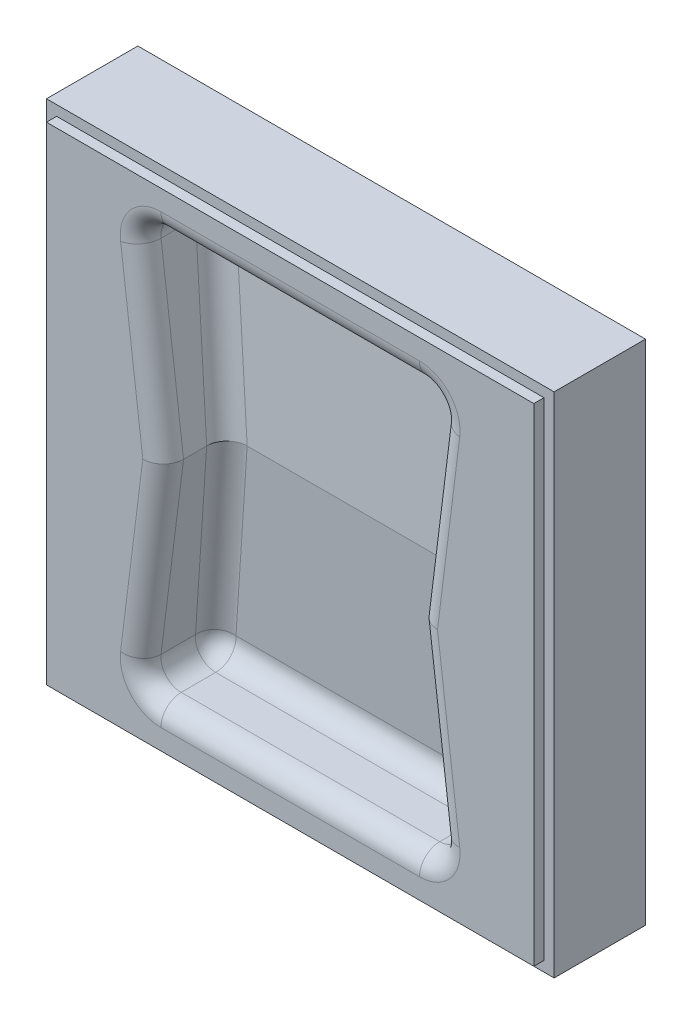
ISO-10303-21;
HEADER;
FILE_DESCRIPTION(('STEP AP214'),'2;1');
FILE_NAME('part.step','',(''),(''),'','','');
FILE_SCHEMA(('AUTOMOTIVE_DESIGN { 1 0 10303 214 1 1 1 1 }'));
ENDSEC;
DATA;
#1=APPLICATION_CONTEXT('core data for automotive mechanical design processes');
#2=APPLICATION_PROTOCOL_DEFINITION('international standard','automotive_design',2000,#1);
#3=PRODUCT_CONTEXT('',#1,'mechanical');
#4=PRODUCT('Part','Part','',(#3));
#5=PRODUCT_RELATED_PRODUCT_CATEGORY('part','',(#4));
#6=PRODUCT_DEFINITION_FORMATION('','',#4);
#7=PRODUCT_DEFINITION_CONTEXT('part definition',#1,'design');
#8=PRODUCT_DEFINITION('design','',#6,#7);
#9=PRODUCT_DEFINITION_SHAPE('','',#8);
#10=(LENGTH_UNIT() NAMED_UNIT(*) SI_UNIT(.MILLI.,.METRE.));
#11=(NAMED_UNIT(*) PLANE_ANGLE_UNIT() SI_UNIT($,.RADIAN.));
#12=(NAMED_UNIT(*) SI_UNIT($,.STERADIAN.) SOLID_ANGLE_UNIT());
#13=UNCERTAINTY_MEASURE_WITH_UNIT(LENGTH_MEASURE(1.E-05),#10,'distance_accuracy_value','');
#14=(GEOMETRIC_REPRESENTATION_CONTEXT(3) GLOBAL_UNCERTAINTY_ASSIGNED_CONTEXT((#13)) GLOBAL_UNIT_ASSIGNED_CONTEXT((#10,
#11,#12)) REPRESENTATION_CONTEXT('',''));
#15=CARTESIAN_POINT('',(0.,0.,0.));
#16=DIRECTION('',(0.,0.,1.));
#17=DIRECTION('',(1.,0.,0.));
#18=AXIS2_PLACEMENT_3D('',#15,#16,#17);
#19=CARTESIAN_POINT('',(15.3846153846154,1.92307692307692,7.5));
#20=DIRECTION('',(0.992277876713668,0.124034734589208,0.));
#21=DIRECTION('',(-0.124034734589208,0.992277876713668,0.));
#22=AXIS2_PLACEMENT_3D('',#19,#20,#21);
#23=PLANE('',#22);
#24=DIRECTION('',(0.,0.,1.));
#25=VECTOR('',#24,1.);
#26=CARTESIAN_POINT('',(10.2810086836473,42.7519305308216,15.));
#27=LINE('',#26,#25);
#28=CARTESIAN_POINT('',(10.2810086836473,42.7519305308216,9.60049247781464));
#29=VERTEX_POINT('',#28);
#30=CARTESIAN_POINT('',(10.2810086836473,42.7519305308216,13.));
#31=VERTEX_POINT('',#30);
#32=EDGE_CURVE('E320',#29,#31,#27,.T.);
#33=ORIENTED_EDGE('',*,*,#32,.T.);
#34=DIRECTION('',(-0.124034734589208,0.992277876713668,0.));
#35=VECTOR('',#34,1.);
#36=CARTESIAN_POINT('',(12.5,25.,13.));
#37=LINE('',#36,#35);
#38=CARTESIAN_POINT('',(12.5,25.,13.));
#39=VERTEX_POINT('',#38);
#40=EDGE_CURVE('E433',#31,#39,#37,.F.);
#41=ORIENTED_EDGE('',*,*,#40,.T.);
#42=DIRECTION('',(0.,0.,1.));
#43=VECTOR('',#42,1.);
#44=CARTESIAN_POINT('',(12.5,25.,7.5));
#45=LINE('',#44,#43);
#46=CARTESIAN_POINT('',(12.5,25.,10.72330400165));
#47=VERTEX_POINT('',#46);
#48=EDGE_CURVE('E515',#47,#39,#45,.T.);
#49=ORIENTED_EDGE('',*,*,#48,.F.);
#50=DIRECTION('',(-0.123791165723687,0.990329325789502,-0.0626384368425683));
#51=VECTOR('',#50,1.);
#52=CARTESIAN_POINT('',(15.3483036097725,2.21357112182013,12.1645480898382));
#53=LINE('',#52,#51);
#54=EDGE_CURVE('E276',#47,#29,#53,.T.);
#55=ORIENTED_EDGE('',*,*,#54,.T.);
#56=EDGE_LOOP('',(#33,#41,#49,#55));
#57=FACE_BOUND('',#56,.T.);
#58=ADVANCED_FACE('F72',(#57),#23,.T.);
#59=CARTESIAN_POINT('',(33.8461538461539,-4.23076923076926,7.5));
#60=DIRECTION('',(-0.992277876713668,0.124034734589209,0.));
#61=DIRECTION('',(-0.124034734589209,-0.992277876713668,0.));
#62=AXIS2_PLACEMENT_3D('',#59,#60,#61);
#63=PLANE('',#62);
#64=DIRECTION('',(0.,0.,-1.));
#65=VECTOR('',#64,1.);
#66=CARTESIAN_POINT('',(37.5,25.,7.5));
#67=LINE('',#66,#65);
#68=CARTESIAN_POINT('',(37.5,25.,13.));
#69=VERTEX_POINT('',#68);
#70=CARTESIAN_POINT('',(37.5,25.,10.72330400165));
#71=VERTEX_POINT('',#70);
#72=EDGE_CURVE('E508',#69,#71,#67,.T.);
#73=ORIENTED_EDGE('',*,*,#72,.F.);
#74=DIRECTION('',(-0.124034734589209,-0.992277876713668,0.));
#75=VECTOR('',#74,1.);
#76=CARTESIAN_POINT('',(39.7189913163527,42.7519305308216,13.));
#77=LINE('',#76,#75);
#78=CARTESIAN_POINT('',(39.7189913163527,42.7519305308216,13.));
#79=VERTEX_POINT('',#78);
#80=EDGE_CURVE('E440',#69,#79,#77,.F.);
#81=ORIENTED_EDGE('',*,*,#80,.T.);
#82=DIRECTION('',(0.,0.,1.));
#83=VECTOR('',#82,1.);
#84=CARTESIAN_POINT('',(39.7189913163527,42.7519305308216,9.45830184102766));
#85=LINE('',#84,#83);
#86=CARTESIAN_POINT('',(39.7189913163527,42.7519305308216,9.60049247781464));
#87=VERTEX_POINT('',#86);
#88=EDGE_CURVE('E365',#79,#87,#85,.F.);
#89=ORIENTED_EDGE('',*,*,#88,.T.);
#90=DIRECTION('',(-0.123791165723688,-0.990329325789502,0.0626384368425683));
#91=VECTOR('',#90,1.);
#92=CARTESIAN_POINT('',(33.885483754666,-3.91612996267166,12.5522523456308));
#93=LINE('',#92,#91);
#94=EDGE_CURVE('E316',#87,#71,#93,.T.);
#95=ORIENTED_EDGE('',*,*,#94,.T.);
#96=EDGE_LOOP('',(#73,#81,#89,#95));
#97=FACE_BOUND('',#96,.T.);
#98=ADVANCED_FACE('F510',(#97),#63,.T.);
#99=CARTESIAN_POINT('',(0.,0.,15.));
#100=DIRECTION('',(0.,0.,-1.));
#101=DIRECTION('',(-1.,0.,0.));
#102=AXIS2_PLACEMENT_3D('',#99,#100,#101);
#103=PLANE('',#102);
#104=CARTESIAN_POINT('',(12.2655644370747,43.,15.));
#105=DIRECTION('',(0.,0.,-1.));
#106=DIRECTION('',(-1.,0.,0.));
#107=AXIS2_PLACEMENT_3D('',#104,#105,#106);
#108=CIRCLE('',#107,4.);
#109=CARTESIAN_POINT('',(8.29645293021997,42.5038610616432,15.));
#110=VERTEX_POINT('',#109);
#111=CARTESIAN_POINT('',(12.2655644370747,47.,15.));
#112=VERTEX_POINT('',#111);
#113=EDGE_CURVE('E427',#110,#112,#108,.T.);
#114=ORIENTED_EDGE('',*,*,#113,.T.);
#115=DIRECTION('',(1.,0.,0.));
#116=VECTOR('',#115,1.);
#117=CARTESIAN_POINT('',(37.7344355629254,47.,15.));
#118=LINE('',#117,#116);
#119=CARTESIAN_POINT('',(37.7344355629254,47.,15.));
#120=VERTEX_POINT('',#119);
#121=EDGE_CURVE('E430',#112,#120,#118,.T.);
#122=ORIENTED_EDGE('',*,*,#121,.T.);
#123=CARTESIAN_POINT('',(37.7344355629254,43.,15.));
#124=DIRECTION('',(0.,0.,-1.));
#125=DIRECTION('',(-1.,0.,0.));
#126=AXIS2_PLACEMENT_3D('',#123,#124,#125);
#127=CIRCLE('',#126,4.);
#128=CARTESIAN_POINT('',(41.70354706978,42.5038610616432,15.));
#129=VERTEX_POINT('',#128);
#130=EDGE_CURVE('E424',#120,#129,#127,.T.);
#131=ORIENTED_EDGE('',*,*,#130,.T.);
#132=DIRECTION('',(-0.124034734589209,-0.992277876713668,0.));
#133=VECTOR('',#132,1.);
#134=CARTESIAN_POINT('',(39.4845557534274,24.7519305308216,15.));
#135=LINE('',#134,#133);
#136=CARTESIAN_POINT('',(39.5155644370747,25.,15.));
#137=VERTEX_POINT('',#136);
#138=EDGE_CURVE('E417',#129,#137,#135,.T.);
#139=ORIENTED_EDGE('',*,*,#138,.T.);
#140=DIRECTION('',(-0.124034734589209,0.992277876713668,0.));
#141=VECTOR('',#140,1.);
#142=CARTESIAN_POINT('',(41.9845557534274,5.24806946917844,15.));
#143=LINE('',#142,#141);
#144=CARTESIAN_POINT('',(41.70354706978,7.49613893835682,15.));
#145=VERTEX_POINT('',#144);
#146=EDGE_CURVE('E408',#137,#145,#143,.F.);
#147=ORIENTED_EDGE('',*,*,#146,.T.);
#148=CARTESIAN_POINT('',(37.7344355629254,7.00000000000001,15.));
#149=DIRECTION('',(0.,0.,-1.));
#150=DIRECTION('',(-1.,0.,0.));
#151=AXIS2_PLACEMENT_3D('',#148,#149,#150);
#152=CIRCLE('',#151,4.);
#153=CARTESIAN_POINT('',(37.7344355629254,3.,15.));
#154=VERTEX_POINT('',#153);
#155=EDGE_CURVE('E405',#145,#154,#152,.T.);
#156=ORIENTED_EDGE('',*,*,#155,.T.);
#157=DIRECTION('',(1.,0.,0.));
#158=VECTOR('',#157,1.);
#159=CARTESIAN_POINT('',(0.,3.,15.));
#160=LINE('',#159,#158);
#161=CARTESIAN_POINT('',(12.2655644370747,3.,15.));
#162=VERTEX_POINT('',#161);
#163=EDGE_CURVE('E380',#154,#162,#160,.F.);
#164=ORIENTED_EDGE('',*,*,#163,.T.);
#165=CARTESIAN_POINT('',(12.2655644370747,7.00000000000001,15.));
#166=DIRECTION('',(0.,0.,-1.));
#167=DIRECTION('',(-1.,0.,0.));
#168=AXIS2_PLACEMENT_3D('',#165,#166,#167);
#169=CIRCLE('',#168,4.);
#170=CARTESIAN_POINT('',(8.29645293021997,7.49613893835682,15.));
#171=VERTEX_POINT('',#170);
#172=EDGE_CURVE('E411',#162,#171,#169,.T.);
#173=ORIENTED_EDGE('',*,*,#172,.T.);
#174=DIRECTION('',(-0.124034734589208,-0.992277876713668,0.));
#175=VECTOR('',#174,1.);
#176=CARTESIAN_POINT('',(7.24621347734189,-0.905776684667736,15.));
#177=LINE('',#176,#175);
#178=CARTESIAN_POINT('',(10.4844355629254,25.,15.));
#179=VERTEX_POINT('',#178);
#180=EDGE_CURVE('E414',#171,#179,#177,.F.);
#181=ORIENTED_EDGE('',*,*,#180,.T.);
#182=DIRECTION('',(-0.124034734589208,0.992277876713668,0.));
#183=VECTOR('',#182,1.);
#184=CARTESIAN_POINT('',(8.29645293021997,42.5038610616432,15.));
#185=LINE('',#184,#183);
#186=EDGE_CURVE('E420',#179,#110,#185,.T.);
#187=ORIENTED_EDGE('',*,*,#186,.T.);
#188=EDGE_LOOP('',(#114,#122,#131,#139,#147,#156,#164,#173,#181,#187));
#189=FACE_BOUND('',#188,.T.);
#190=DIRECTION('',(-1.,0.,0.));
#191=VECTOR('',#190,1.);
#192=CARTESIAN_POINT('',(1.,49.,15.));
#193=LINE('',#192,#191);
#194=CARTESIAN_POINT('',(49.,49.,15.));
#195=VERTEX_POINT('',#194);
#196=CARTESIAN_POINT('',(1.,49.,15.));
#197=VERTEX_POINT('',#196);
#198=EDGE_CURVE('E521',#195,#197,#193,.T.);
#199=ORIENTED_EDGE('',*,*,#198,.T.);
#200=DIRECTION('',(0.,-1.,0.));
#201=VECTOR('',#200,1.);
#202=CARTESIAN_POINT('',(1.,49.,15.));
#203=LINE('',#202,#201);
#204=CARTESIAN_POINT('',(1.,1.,15.));
#205=VERTEX_POINT('',#204);
#206=EDGE_CURVE('E547',#197,#205,#203,.T.);
#207=ORIENTED_EDGE('',*,*,#206,.T.);
#208=DIRECTION('',(1.,0.,0.));
#209=VECTOR('',#208,1.);
#210=CARTESIAN_POINT('',(1.,1.,15.));
#211=LINE('',#210,#209);
#212=CARTESIAN_POINT('',(49.,1.,15.));
#213=VERTEX_POINT('',#212);
#214=EDGE_CURVE('E551',#205,#213,#211,.T.);
#215=ORIENTED_EDGE('',*,*,#214,.T.);
#216=DIRECTION('',(0.,1.,0.));
#217=VECTOR('',#216,1.);
#218=CARTESIAN_POINT('',(49.,49.,15.));
#219=LINE('',#218,#217);
#220=EDGE_CURVE('E531',#213,#195,#219,.T.);
#221=ORIENTED_EDGE('',*,*,#220,.T.);
#222=EDGE_LOOP('',(#199,#207,#215,#221));
#223=FACE_BOUND('',#222,.T.);
#224=ADVANCED_FACE('F617',(#189,#223),#103,.F.);
#225=CARTESIAN_POINT('',(0.,0.,15.));
#226=DIRECTION('',(1.,0.,0.));
#227=DIRECTION('',(0.,0.,-1.));
#228=AXIS2_PLACEMENT_3D('',#225,#226,#227);
#229=PLANE('',#228);
#230=DIRECTION('',(0.,0.,-1.));
#231=VECTOR('',#230,1.);
#232=CARTESIAN_POINT('',(0.,50.,15.));
#233=LINE('',#232,#231);
#234=CARTESIAN_POINT('',(0.,50.,14.));
#235=VERTEX_POINT('',#234);
#236=CARTESIAN_POINT('',(0.,50.,5.));
#237=VERTEX_POINT('',#236);
#238=EDGE_CURVE('E268',#235,#237,#233,.T.);
#239=ORIENTED_EDGE('',*,*,#238,.T.);
#240=DIRECTION('',(0.,1.,0.));
#241=VECTOR('',#240,1.);
#242=CARTESIAN_POINT('',(0.,0.,5.));
#243=LINE('',#242,#241);
#244=CARTESIAN_POINT('',(0.,0.,5.));
#245=VERTEX_POINT('',#244);
#246=EDGE_CURVE('E250',#245,#237,#243,.T.);
#247=ORIENTED_EDGE('',*,*,#246,.F.);
#248=DIRECTION('',(0.,0.,-1.));
#249=VECTOR('',#248,1.);
#250=CARTESIAN_POINT('',(0.,0.,15.));
#251=LINE('',#250,#249);
#252=CARTESIAN_POINT('',(0.,0.,14.));
#253=VERTEX_POINT('',#252);
#254=EDGE_CURVE('E266',#253,#245,#251,.T.);
#255=ORIENTED_EDGE('',*,*,#254,.F.);
#256=DIRECTION('',(0.,-1.,0.));
#257=VECTOR('',#256,1.);
#258=CARTESIAN_POINT('',(0.,50.,14.));
#259=LINE('',#258,#257);
#260=EDGE_CURVE('E561',#235,#253,#259,.T.);
#261=ORIENTED_EDGE('',*,*,#260,.F.);
#262=EDGE_LOOP('',(#239,#247,#255,#261));
#263=FACE_BOUND('',#262,.T.);
#264=ADVANCED_FACE('F264',(#263),#229,.F.);
#265=CARTESIAN_POINT('',(0.,0.,15.));
#266=DIRECTION('',(0.,1.,0.));
#267=DIRECTION('',(0.,0.,1.));
#268=AXIS2_PLACEMENT_3D('',#265,#266,#267);
#269=PLANE('',#268);
#270=ORIENTED_EDGE('',*,*,#254,.T.);
#271=DIRECTION('',(-1.,0.,0.));
#272=VECTOR('',#271,1.);
#273=CARTESIAN_POINT('',(50.,0.,5.));
#274=LINE('',#273,#272);
#275=CARTESIAN_POINT('',(50.,0.,5.));
#276=VERTEX_POINT('',#275);
#277=EDGE_CURVE('E247',#276,#245,#274,.T.);
#278=ORIENTED_EDGE('',*,*,#277,.F.);
#279=DIRECTION('',(0.,0.,-1.));
#280=VECTOR('',#279,1.);
#281=CARTESIAN_POINT('',(50.,0.,15.));
#282=LINE('',#281,#280);
#283=CARTESIAN_POINT('',(50.,0.,14.));
#284=VERTEX_POINT('',#283);
#285=EDGE_CURVE('E277',#284,#276,#282,.T.);
#286=ORIENTED_EDGE('',*,*,#285,.F.);
#287=DIRECTION('',(1.,0.,0.));
#288=VECTOR('',#287,1.);
#289=CARTESIAN_POINT('',(0.,0.,14.));
#290=LINE('',#289,#288);
#291=EDGE_CURVE('E274',#253,#284,#290,.T.);
#292=ORIENTED_EDGE('',*,*,#291,.F.);
#293=EDGE_LOOP('',(#270,#278,#286,#292));
#294=FACE_BOUND('',#293,.T.);
#295=ADVANCED_FACE('F273',(#294),#269,.F.);
#296=CARTESIAN_POINT('',(50.,0.,15.));
#297=DIRECTION('',(-1.,0.,0.));
#298=DIRECTION('',(0.,0.,1.));
#299=AXIS2_PLACEMENT_3D('',#296,#297,#298);
#300=PLANE('',#299);
#301=ORIENTED_EDGE('',*,*,#285,.T.);
#302=DIRECTION('',(0.,1.,0.));
#303=VECTOR('',#302,1.);
#304=CARTESIAN_POINT('',(50.,0.,5.));
#305=LINE('',#304,#303);
#306=CARTESIAN_POINT('',(50.,50.,5.));
#307=VERTEX_POINT('',#306);
#308=EDGE_CURVE('E253',#276,#307,#305,.T.);
#309=ORIENTED_EDGE('',*,*,#308,.T.);
#310=DIRECTION('',(0.,0.,-1.));
#311=VECTOR('',#310,1.);
#312=CARTESIAN_POINT('',(50.,50.,15.));
#313=LINE('',#312,#311);
#314=CARTESIAN_POINT('',(50.,50.,14.));
#315=VERTEX_POINT('',#314);
#316=EDGE_CURVE('E284',#315,#307,#313,.T.);
#317=ORIENTED_EDGE('',*,*,#316,.F.);
#318=DIRECTION('',(0.,1.,0.));
#319=VECTOR('',#318,1.);
#320=CARTESIAN_POINT('',(50.,50.,14.));
#321=LINE('',#320,#319);
#322=EDGE_CURVE('E575',#284,#315,#321,.T.);
#323=ORIENTED_EDGE('',*,*,#322,.F.);
#324=EDGE_LOOP('',(#301,#309,#317,#323));
#325=FACE_BOUND('',#324,.T.);
#326=ADVANCED_FACE('F590',(#325),#300,.F.);
#327=CARTESIAN_POINT('',(0.,50.,15.));
#328=DIRECTION('',(0.,-1.,0.));
#329=DIRECTION('',(0.,0.,-1.));
#330=AXIS2_PLACEMENT_3D('',#327,#328,#329);
#331=PLANE('',#330);
#332=ORIENTED_EDGE('',*,*,#316,.T.);
#333=DIRECTION('',(-1.,0.,0.));
#334=VECTOR('',#333,1.);
#335=CARTESIAN_POINT('',(50.,50.,5.));
#336=LINE('',#335,#334);
#337=EDGE_CURVE('E259',#307,#237,#336,.T.);
#338=ORIENTED_EDGE('',*,*,#337,.T.);
#339=ORIENTED_EDGE('',*,*,#238,.F.);
#340=DIRECTION('',(-1.,0.,0.));
#341=VECTOR('',#340,1.);
#342=CARTESIAN_POINT('',(0.,50.,14.));
#343=LINE('',#342,#341);
#344=EDGE_CURVE('E578',#315,#235,#343,.T.);
#345=ORIENTED_EDGE('',*,*,#344,.F.);
#346=EDGE_LOOP('',(#332,#338,#339,#345));
#347=FACE_BOUND('',#346,.T.);
#348=ADVANCED_FACE('F587',(#347),#331,.F.);
#349=CARTESIAN_POINT('',(0.,0.,14.));
#350=DIRECTION('',(0.,0.,1.));
#351=DIRECTION('',(1.,0.,0.));
#352=AXIS2_PLACEMENT_3D('',#349,#350,#351);
#353=PLANE('',#352);
#354=DIRECTION('',(0.,1.,0.));
#355=VECTOR('',#354,1.);
#356=CARTESIAN_POINT('',(49.,49.,14.));
#357=LINE('',#356,#355);
#358=CARTESIAN_POINT('',(49.,1.,14.));
#359=VERTEX_POINT('',#358);
#360=CARTESIAN_POINT('',(49.,49.,14.));
#361=VERTEX_POINT('',#360);
#362=EDGE_CURVE('E539',#359,#361,#357,.T.);
#363=ORIENTED_EDGE('',*,*,#362,.F.);
#364=DIRECTION('',(1.,0.,0.));
#365=VECTOR('',#364,1.);
#366=CARTESIAN_POINT('',(1.,1.,14.));
#367=LINE('',#366,#365);
#368=CARTESIAN_POINT('',(1.,1.,14.));
#369=VERTEX_POINT('',#368);
#370=EDGE_CURVE('E535',#369,#359,#367,.T.);
#371=ORIENTED_EDGE('',*,*,#370,.F.);
#372=DIRECTION('',(0.,-1.,0.));
#373=VECTOR('',#372,1.);
#374=CARTESIAN_POINT('',(1.,49.,14.));
#375=LINE('',#374,#373);
#376=CARTESIAN_POINT('',(1.,49.,14.));
#377=VERTEX_POINT('',#376);
#378=EDGE_CURVE('E530',#377,#369,#375,.T.);
#379=ORIENTED_EDGE('',*,*,#378,.F.);
#380=DIRECTION('',(-1.,0.,0.));
#381=VECTOR('',#380,1.);
#382=CARTESIAN_POINT('',(1.,49.,14.));
#383=LINE('',#382,#381);
#384=EDGE_CURVE('E526',#361,#377,#383,.T.);
#385=ORIENTED_EDGE('',*,*,#384,.F.);
#386=EDGE_LOOP('',(#363,#371,#379,#385));
#387=FACE_BOUND('',#386,.T.);
#388=ORIENTED_EDGE('',*,*,#260,.T.);
#389=ORIENTED_EDGE('',*,*,#291,.T.);
#390=ORIENTED_EDGE('',*,*,#322,.T.);
#391=ORIENTED_EDGE('',*,*,#344,.T.);
#392=EDGE_LOOP('',(#388,#389,#390,#391));
#393=FACE_BOUND('',#392,.T.);
#394=ADVANCED_FACE('F596',(#387,#393),#353,.T.);
#395=CARTESIAN_POINT('',(1.,49.,14.));
#396=DIRECTION('',(0.,1.,0.));
#397=DIRECTION('',(0.,0.,1.));
#398=AXIS2_PLACEMENT_3D('',#395,#396,#397);
#399=PLANE('',#398);
#400=ORIENTED_EDGE('',*,*,#198,.F.);
#401=DIRECTION('',(0.,0.,1.));
#402=VECTOR('',#401,1.);
#403=CARTESIAN_POINT('',(49.,49.,14.));
#404=LINE('',#403,#402);
#405=EDGE_CURVE('E558',#361,#195,#404,.T.);
#406=ORIENTED_EDGE('',*,*,#405,.F.);
#407=ORIENTED_EDGE('',*,*,#384,.T.);
#408=DIRECTION('',(0.,0.,1.));
#409=VECTOR('',#408,1.);
#410=CARTESIAN_POINT('',(1.,49.,14.));
#411=LINE('',#410,#409);
#412=EDGE_CURVE('E543',#377,#197,#411,.T.);
#413=ORIENTED_EDGE('',*,*,#412,.T.);
#414=EDGE_LOOP('',(#400,#406,#407,#413));
#415=FACE_BOUND('',#414,.T.);
#416=ADVANCED_FACE('F598',(#415),#399,.T.);
#417=CARTESIAN_POINT('',(49.,49.,14.));
#418=DIRECTION('',(1.,0.,0.));
#419=DIRECTION('',(0.,0.,-1.));
#420=AXIS2_PLACEMENT_3D('',#417,#418,#419);
#421=PLANE('',#420);
#422=ORIENTED_EDGE('',*,*,#220,.F.);
#423=DIRECTION('',(0.,0.,1.));
#424=VECTOR('',#423,1.);
#425=CARTESIAN_POINT('',(49.,1.,14.));
#426=LINE('',#425,#424);
#427=EDGE_CURVE('E562',#359,#213,#426,.T.);
#428=ORIENTED_EDGE('',*,*,#427,.F.);
#429=ORIENTED_EDGE('',*,*,#362,.T.);
#430=ORIENTED_EDGE('',*,*,#405,.T.);
#431=EDGE_LOOP('',(#422,#428,#429,#430));
#432=FACE_BOUND('',#431,.T.);
#433=ADVANCED_FACE('F605',(#432),#421,.T.);
#434=CARTESIAN_POINT('',(1.,1.,14.));
#435=DIRECTION('',(0.,-1.,0.));
#436=DIRECTION('',(1.,0.,0.));
#437=AXIS2_PLACEMENT_3D('',#434,#435,#436);
#438=PLANE('',#437);
#439=ORIENTED_EDGE('',*,*,#214,.F.);
#440=DIRECTION('',(0.,0.,1.));
#441=VECTOR('',#440,1.);
#442=CARTESIAN_POINT('',(1.,1.,14.));
#443=LINE('',#442,#441);
#444=EDGE_CURVE('E565',#369,#205,#443,.T.);
#445=ORIENTED_EDGE('',*,*,#444,.F.);
#446=ORIENTED_EDGE('',*,*,#370,.T.);
#447=ORIENTED_EDGE('',*,*,#427,.T.);
#448=EDGE_LOOP('',(#439,#445,#446,#447));
#449=FACE_BOUND('',#448,.T.);
#450=ADVANCED_FACE('F632',(#449),#438,.T.);
#451=CARTESIAN_POINT('',(1.,49.,14.));
#452=DIRECTION('',(-1.,0.,0.));
#453=DIRECTION('',(0.,0.,1.));
#454=AXIS2_PLACEMENT_3D('',#451,#452,#453);
#455=PLANE('',#454);
#456=ORIENTED_EDGE('',*,*,#206,.F.);
#457=ORIENTED_EDGE('',*,*,#412,.F.);
#458=ORIENTED_EDGE('',*,*,#378,.T.);
#459=ORIENTED_EDGE('',*,*,#444,.T.);
#460=EDGE_LOOP('',(#456,#457,#458,#459));
#461=FACE_BOUND('',#460,.T.);
#462=ADVANCED_FACE('F636',(#461),#455,.T.);
#463=CARTESIAN_POINT('',(0.,5.,7.5));
#464=DIRECTION('',(0.,-1.,0.));
#465=DIRECTION('',(1.,0.,0.));
#466=AXIS2_PLACEMENT_3D('',#463,#464,#465);
#467=PLANE('',#466);
#468=DIRECTION('',(0.,0.,1.));
#469=VECTOR('',#468,1.);
#470=CARTESIAN_POINT('',(12.2655644370747,5.,15.));
#471=LINE('',#470,#469);
#472=CARTESIAN_POINT('',(12.2655644370747,5.,9.60049247781466));
#473=VERTEX_POINT('',#472);
#474=CARTESIAN_POINT('',(12.2655644370747,5.,13.));
#475=VERTEX_POINT('',#474);
#476=EDGE_CURVE('E371',#473,#475,#471,.T.);
#477=ORIENTED_EDGE('',*,*,#476,.T.);
#478=DIRECTION('',(1.,0.,0.));
#479=VECTOR('',#478,1.);
#480=CARTESIAN_POINT('',(0.,5.,13.));
#481=LINE('',#480,#479);
#482=CARTESIAN_POINT('',(37.7344355629254,5.,13.));
#483=VERTEX_POINT('',#482);
#484=EDGE_CURVE('E12',#475,#483,#481,.T.);
#485=ORIENTED_EDGE('',*,*,#484,.T.);
#486=DIRECTION('',(0.,0.,1.));
#487=VECTOR('',#486,1.);
#488=CARTESIAN_POINT('',(37.7344355629254,5.,9.60049247781466));
#489=LINE('',#488,#487);
#490=CARTESIAN_POINT('',(37.7344355629254,5.,9.60049247781466));
#491=VERTEX_POINT('',#490);
#492=EDGE_CURVE('E368',#483,#491,#489,.F.);
#493=ORIENTED_EDGE('',*,*,#492,.T.);
#494=DIRECTION('',(1.,0.,0.));
#495=VECTOR('',#494,1.);
#496=CARTESIAN_POINT('',(0.,5.,9.60049247781466));
#497=LINE('',#496,#495);
#498=EDGE_CURVE('E309',#491,#473,#497,.F.);
#499=ORIENTED_EDGE('',*,*,#498,.T.);
#500=EDGE_LOOP('',(#477,#485,#493,#499));
#501=FACE_BOUND('',#500,.T.);
#502=ADVANCED_FACE('F621',(#501),#467,.F.);
#503=CARTESIAN_POINT('',(0.,45.,7.5));
#504=DIRECTION('',(0.,-1.,0.));
#505=DIRECTION('',(0.,0.,-1.));
#506=AXIS2_PLACEMENT_3D('',#503,#504,#505);
#507=PLANE('',#506);
#508=DIRECTION('',(0.,0.,1.));
#509=VECTOR('',#508,1.);
#510=CARTESIAN_POINT('',(37.7344355629254,45.,15.));
#511=LINE('',#510,#509);
#512=CARTESIAN_POINT('',(37.7344355629254,45.,9.60049247781464));
#513=VERTEX_POINT('',#512);
#514=CARTESIAN_POINT('',(37.7344355629254,45.,13.));
#515=VERTEX_POINT('',#514);
#516=EDGE_CURVE('E332',#513,#515,#511,.T.);
#517=ORIENTED_EDGE('',*,*,#516,.T.);
#518=DIRECTION('',(1.,0.,0.));
#519=VECTOR('',#518,1.);
#520=CARTESIAN_POINT('',(12.2655644370747,45.,13.));
#521=LINE('',#520,#519);
#522=CARTESIAN_POINT('',(12.2655644370747,45.,13.));
#523=VERTEX_POINT('',#522);
#524=EDGE_CURVE('E82',#515,#523,#521,.F.);
#525=ORIENTED_EDGE('',*,*,#524,.T.);
#526=DIRECTION('',(0.,0.,1.));
#527=VECTOR('',#526,1.);
#528=CARTESIAN_POINT('',(12.2655644370747,45.,9.45830184102766));
#529=LINE('',#528,#527);
#530=CARTESIAN_POINT('',(12.2655644370747,45.,9.60049247781464));
#531=VERTEX_POINT('',#530);
#532=EDGE_CURVE('E339',#523,#531,#529,.F.);
#533=ORIENTED_EDGE('',*,*,#532,.T.);
#534=DIRECTION('',(1.,0.,0.));
#535=VECTOR('',#534,1.);
#536=CARTESIAN_POINT('',(0.,45.,9.60049247781464));
#537=LINE('',#536,#535);
#538=EDGE_CURVE('E336',#531,#513,#537,.T.);
#539=ORIENTED_EDGE('',*,*,#538,.T.);
#540=EDGE_LOOP('',(#517,#525,#533,#539));
#541=FACE_BOUND('',#540,.T.);
#542=ADVANCED_FACE('F625',(#541),#507,.T.);
#543=CARTESIAN_POINT('',(40.,5.,7.5));
#544=DIRECTION('',(0.992277876713668,0.124034734589209,0.));
#545=DIRECTION('',(-0.124034734589209,0.992277876713668,0.));
#546=AXIS2_PLACEMENT_3D('',#543,#544,#545);
#547=PLANE('',#546);
#548=DIRECTION('',(0.,0.,1.));
#549=VECTOR('',#548,1.);
#550=CARTESIAN_POINT('',(39.7189913163527,7.24806946917844,15.));
#551=LINE('',#550,#549);
#552=CARTESIAN_POINT('',(39.7189913163527,7.24806946917844,9.60049247781466));
#553=VERTEX_POINT('',#552);
#554=CARTESIAN_POINT('',(39.7189913163527,7.24806946917844,13.));
#555=VERTEX_POINT('',#554);
#556=EDGE_CURVE('E377',#553,#555,#551,.T.);
#557=ORIENTED_EDGE('',*,*,#556,.T.);
#558=DIRECTION('',(-0.124034734589209,0.992277876713668,0.));
#559=VECTOR('',#558,1.);
#560=CARTESIAN_POINT('',(40.,5.,13.));
#561=LINE('',#560,#559);
#562=EDGE_CURVE('E452',#555,#69,#561,.T.);
#563=ORIENTED_EDGE('',*,*,#562,.T.);
#564=ORIENTED_EDGE('',*,*,#72,.T.);
#565=DIRECTION('',(0.123791165723688,-0.990329325789502,-0.0626384368425673));
#566=VECTOR('',#565,1.);
#567=CARTESIAN_POINT('',(40.0151848391579,4.87852128673716,9.45061829929032));
#568=LINE('',#567,#566);
#569=EDGE_CURVE('E305',#71,#553,#568,.T.);
#570=ORIENTED_EDGE('',*,*,#569,.T.);
#571=EDGE_LOOP('',(#557,#563,#564,#570));
#572=FACE_BOUND('',#571,.T.);
#573=ADVANCED_FACE('F507',(#572),#547,.F.);
#574=CARTESIAN_POINT('',(15.,45.,7.5));
#575=DIRECTION('',(-0.992277876713668,0.124034734589208,0.));
#576=DIRECTION('',(-0.124034734589208,-0.992277876713668,0.));
#577=AXIS2_PLACEMENT_3D('',#574,#575,#576);
#578=PLANE('',#577);
#579=ORIENTED_EDGE('',*,*,#48,.T.);
#580=DIRECTION('',(-0.124034734589208,-0.992277876713668,0.));
#581=VECTOR('',#580,1.);
#582=CARTESIAN_POINT('',(15.,45.,13.));
#583=LINE('',#582,#581);
#584=CARTESIAN_POINT('',(10.2810086836473,7.24806946917844,13.));
#585=VERTEX_POINT('',#584);
#586=EDGE_CURVE('E446',#39,#585,#583,.T.);
#587=ORIENTED_EDGE('',*,*,#586,.T.);
#588=DIRECTION('',(0.,0.,1.));
#589=VECTOR('',#588,1.);
#590=CARTESIAN_POINT('',(10.2810086836473,7.24806946917844,9.60049247781466));
#591=LINE('',#590,#589);
#592=CARTESIAN_POINT('',(10.2810086836473,7.24806946917844,9.60049247781466));
#593=VERTEX_POINT('',#592);
#594=EDGE_CURVE('E374',#585,#593,#591,.F.);
#595=ORIENTED_EDGE('',*,*,#594,.T.);
#596=DIRECTION('',(0.123791165723688,0.990329325789502,0.0626384368425673));
#597=VECTOR('',#596,1.);
#598=CARTESIAN_POINT('',(14.9651972919917,44.7215783359339,11.9706959619419));
#599=LINE('',#598,#597);
#600=EDGE_CURVE('E313',#593,#47,#599,.T.);
#601=ORIENTED_EDGE('',*,*,#600,.T.);
#602=EDGE_LOOP('',(#579,#587,#595,#601));
#603=FACE_BOUND('',#602,.T.);
#604=ADVANCED_FACE('F624',(#603),#578,.F.);
#605=CARTESIAN_POINT('',(0.,-0.450672204364067,7.12524007298718));
#606=DIRECTION('',(0.,-0.0631239679426226,0.998005693706794));
#607=DIRECTION('',(0.,-0.998005693706794,-0.0631239679426226));
#608=AXIS2_PLACEMENT_3D('',#605,#606,#607);
#609=PLANE('',#608);
#610=DIRECTION('',(1.,0.,0.));
#611=VECTOR('',#610,1.);
#612=CARTESIAN_POINT('',(0.,25.,8.73499783937769));
#613=LINE('',#612,#611);
#614=CARTESIAN_POINT('',(14.499783445089,25.,8.73499783937769));
#615=VERTEX_POINT('',#614);
#616=CARTESIAN_POINT('',(35.500216554911,25.,8.73499783937769));
#617=VERTEX_POINT('',#616);
#618=EDGE_CURVE('E516',#615,#617,#613,.T.);
#619=ORIENTED_EDGE('',*,*,#618,.F.);
#620=DIRECTION('',(0.123791165723688,0.990329325789502,0.0626384368425673));
#621=VECTOR('',#620,1.);
#622=CARTESIAN_POINT('',(11.1450026403391,-1.8382464379989,7.03747585280858));
#623=LINE('',#622,#621);
#624=CARTESIAN_POINT('',(12.2655644370747,7.12624793588523,7.60448109040107));
#625=VERTEX_POINT('',#624);
#626=EDGE_CURVE('E301',#615,#625,#623,.F.);
#627=ORIENTED_EDGE('',*,*,#626,.T.);
#628=DIRECTION('',(1.,0.,0.));
#629=VECTOR('',#628,1.);
#630=CARTESIAN_POINT('',(0.,7.12624793588523,7.60448109040107));
#631=LINE('',#630,#629);
#632=CARTESIAN_POINT('',(37.7344355629254,7.12624793588523,7.60448109040107));
#633=VERTEX_POINT('',#632);
#634=EDGE_CURVE('E297',#625,#633,#631,.T.);
#635=ORIENTED_EDGE('',*,*,#634,.T.);
#636=DIRECTION('',(0.123791165723688,-0.990329325789502,-0.0626384368425673));
#637=VECTOR('',#636,1.);
#638=CARTESIAN_POINT('',(38.0887847240994,4.29145464649294,7.42518010860113));
#639=LINE('',#638,#637);
#640=EDGE_CURVE('E294',#633,#617,#639,.F.);
#641=ORIENTED_EDGE('',*,*,#640,.T.);
#642=EDGE_LOOP('',(#619,#627,#635,#641));
#643=FACE_BOUND('',#642,.T.);
#644=ADVANCED_FACE('F628',(#643),#609,.T.);
#645=CARTESIAN_POINT('',(0.,0.649903970805166,10.2751440437923));
#646=DIRECTION('',(0.,-0.0631239679426235,-0.998005693706794));
#647=DIRECTION('',(0.,0.998005693706794,-0.0631239679426235));
#648=AXIS2_PLACEMENT_3D('',#645,#646,#647);
#649=PLANE('',#648);
#650=DIRECTION('',(-0.123791165723688,-0.990329325789502,0.0626384368425683));
#651=VECTOR('',#650,1.);
#652=CARTESIAN_POINT('',(31.9590836396076,-3.32906332242744,10.5268141549416));
#653=LINE('',#652,#651);
#654=CARTESIAN_POINT('',(37.7344355629254,42.8737520641148,7.60448109040106));
#655=VERTEX_POINT('',#654);
#656=EDGE_CURVE('E282',#617,#655,#653,.F.);
#657=ORIENTED_EDGE('',*,*,#656,.T.);
#658=DIRECTION('',(1.,0.,0.));
#659=VECTOR('',#658,1.);
#660=CARTESIAN_POINT('',(0.,42.8737520641148,7.60448109040106));
#661=LINE('',#660,#659);
#662=CARTESIAN_POINT('',(12.2655644370747,42.8737520641148,7.60448109040106));
#663=VERTEX_POINT('',#662);
#664=EDGE_CURVE('E345',#655,#663,#661,.F.);
#665=ORIENTED_EDGE('',*,*,#664,.T.);
#666=DIRECTION('',(-0.123791165723687,0.990329325789502,-0.0626384368425683));
#667=VECTOR('',#666,1.);
#668=CARTESIAN_POINT('',(17.2747037248309,2.80063776206441,10.139109899149));
#669=LINE('',#668,#667);
#670=EDGE_CURVE('E291',#663,#615,#669,.F.);
#671=ORIENTED_EDGE('',*,*,#670,.T.);
#672=ORIENTED_EDGE('',*,*,#618,.T.);
#673=EDGE_LOOP('',(#657,#665,#671,#672));
#674=FACE_BOUND('',#673,.T.);
#675=ADVANCED_FACE('F652',(#674),#649,.F.);
#676=CARTESIAN_POINT('',(50.,0.,5.));
#677=DIRECTION('',(0.,0.,1.));
#678=DIRECTION('',(1.,0.,0.));
#679=AXIS2_PLACEMENT_3D('',#676,#677,#678);
#680=PLANE('',#679);
#681=ORIENTED_EDGE('',*,*,#337,.F.);
#682=ORIENTED_EDGE('',*,*,#308,.F.);
#683=ORIENTED_EDGE('',*,*,#277,.T.);
#684=ORIENTED_EDGE('',*,*,#246,.T.);
#685=EDGE_LOOP('',(#681,#682,#683,#684));
#686=FACE_BOUND('',#685,.T.);
#687=ADVANCED_FACE('F249',(#686),#680,.F.);
#688=CARTESIAN_POINT('',(0.,7.00000000000001,9.60049247781466));
#689=DIRECTION('',(1.,0.,0.));
#690=DIRECTION('',(0.,1.,0.));
#691=AXIS2_PLACEMENT_3D('',#688,#689,#690);
#692=CYLINDRICAL_SURFACE('',#691,2.);
#693=ORIENTED_EDGE('',*,*,#634,.F.);
#694=CARTESIAN_POINT('',(12.2655644370747,7.00000000000001,9.60049247781466));
#695=DIRECTION('',(1.,0.,0.));
#696=DIRECTION('',(0.,1.,0.));
#697=AXIS2_PLACEMENT_3D('',#694,#695,#696);
#698=CIRCLE('',#697,2.);
#699=EDGE_CURVE('E358',#625,#473,#698,.F.);
#700=ORIENTED_EDGE('',*,*,#699,.T.);
#701=ORIENTED_EDGE('',*,*,#498,.F.);
#702=CARTESIAN_POINT('',(37.7344355629253,7.00000000000001,9.60049247781466));
#703=DIRECTION('',(1.,0.,0.));
#704=DIRECTION('',(0.,1.,0.));
#705=AXIS2_PLACEMENT_3D('',#702,#703,#704);
#706=CIRCLE('',#705,2.);
#707=EDGE_CURVE('E355',#491,#633,#706,.T.);
#708=ORIENTED_EDGE('',*,*,#707,.T.);
#709=EDGE_LOOP('',(#693,#700,#701,#708));
#710=FACE_BOUND('',#709,.T.);
#711=ADVANCED_FACE('F658',(#710),#692,.F.);
#712=CARTESIAN_POINT('',(16.9497530454191,44.4735088667556,11.9706959619419));
#713=DIRECTION('',(0.123791165723688,0.990329325789502,0.0626384368425673));
#714=DIRECTION('',(-0.992277876713668,0.124034734589208,0.));
#715=AXIS2_PLACEMENT_3D('',#712,#713,#714);
#716=CYLINDRICAL_SURFACE('',#715,2.);
#717=ORIENTED_EDGE('',*,*,#600,.F.);
#718=CARTESIAN_POINT('',(12.2655644370747,7.00000000000001,9.60049247781466));
#719=DIRECTION('',(0.123791165723688,0.990329325789502,0.0626384368425673));
#720=DIRECTION('',(-0.992277876713668,0.124034734589208,0.));
#721=AXIS2_PLACEMENT_3D('',#718,#719,#720);
#722=CIRCLE('',#721,2.);
#723=EDGE_CURVE('E351',#593,#625,#722,.F.);
#724=ORIENTED_EDGE('',*,*,#723,.T.);
#725=ORIENTED_EDGE('',*,*,#626,.F.);
#726=CARTESIAN_POINT('',(14.5155644370746,25.,10.7389944223747));
#727=DIRECTION('',(0.,1.,0.));
#728=DIRECTION('',(0.892275164853808,0.,0.451492004563879));
#729=AXIS2_PLACEMENT_3D('',#726,#727,#728);
#730=ELLIPSE('',#729,2.01953021880431,2.);
#731=EDGE_CURVE('E270',#47,#615,#730,.F.);
#732=ORIENTED_EDGE('',*,*,#731,.F.);
#733=EDGE_LOOP('',(#717,#724,#725,#732));
#734=FACE_BOUND('',#733,.T.);
#735=ADVANCED_FACE('F662',(#734),#716,.F.);
#736=CARTESIAN_POINT('',(38.0306290857305,4.63045181755872,9.45061829929032));
#737=DIRECTION('',(0.123791165723688,-0.990329325789502,-0.0626384368425673));
#738=DIRECTION('',(0.992277876713668,0.124034734589209,0.));
#739=AXIS2_PLACEMENT_3D('',#736,#737,#738);
#740=CYLINDRICAL_SURFACE('',#739,2.);
#741=ORIENTED_EDGE('',*,*,#640,.F.);
#742=CARTESIAN_POINT('',(37.7344355629254,7.00000000000001,9.60049247781466));
#743=DIRECTION('',(0.123791165723688,-0.990329325789502,-0.0626384368425673));
#744=DIRECTION('',(0.992277876713668,0.124034734589209,0.));
#745=AXIS2_PLACEMENT_3D('',#742,#743,#744);
#746=CIRCLE('',#745,2.);
#747=EDGE_CURVE('E361',#633,#553,#746,.T.);
#748=ORIENTED_EDGE('',*,*,#747,.T.);
#749=ORIENTED_EDGE('',*,*,#569,.F.);
#750=CARTESIAN_POINT('',(35.4844355629254,25.,10.7389944223747));
#751=DIRECTION('',(0.,-1.,0.));
#752=DIRECTION('',(0.892275164853809,0.,-0.451492004563878));
#753=AXIS2_PLACEMENT_3D('',#750,#751,#752);
#754=ELLIPSE('',#753,2.01953021880431,2.);
#755=EDGE_CURVE('E321',#617,#71,#754,.T.);
#756=ORIENTED_EDGE('',*,*,#755,.F.);
#757=EDGE_LOOP('',(#741,#748,#749,#756));
#758=FACE_BOUND('',#757,.T.);
#759=ADVANCED_FACE('F668',(#758),#740,.F.);
#760=CARTESIAN_POINT('',(17.3328593631998,2.46164059099857,12.1645480898382));
#761=DIRECTION('',(-0.123791165723687,0.990329325789502,-0.0626384368425683));
#762=DIRECTION('',(-0.992277876713668,-0.124034734589208,0.));
#763=AXIS2_PLACEMENT_3D('',#760,#761,#762);
#764=CYLINDRICAL_SURFACE('',#763,2.);
#765=ORIENTED_EDGE('',*,*,#670,.F.);
#766=CARTESIAN_POINT('',(12.2655644370747,43.,9.60049247781464));
#767=DIRECTION('',(-0.123791165723687,0.990329325789502,-0.0626384368425683));
#768=DIRECTION('',(-0.992277876713668,-0.124034734589208,0.));
#769=AXIS2_PLACEMENT_3D('',#766,#767,#768);
#770=CIRCLE('',#769,2.);
#771=EDGE_CURVE('E342',#663,#29,#770,.T.);
#772=ORIENTED_EDGE('',*,*,#771,.T.);
#773=ORIENTED_EDGE('',*,*,#54,.F.);
#774=ORIENTED_EDGE('',*,*,#731,.T.);
#775=EDGE_LOOP('',(#765,#772,#773,#774));
#776=FACE_BOUND('',#775,.T.);
#777=ADVANCED_FACE('F793',(#776),#764,.F.);
#778=CARTESIAN_POINT('',(31.9009280012387,-3.66806049349322,12.5522523456308));
#779=DIRECTION('',(-0.123791165723688,-0.990329325789502,0.0626384368425683));
#780=DIRECTION('',(0.992277876713668,-0.124034734589209,0.));
#781=AXIS2_PLACEMENT_3D('',#778,#779,#780);
#782=CYLINDRICAL_SURFACE('',#781,2.);
#783=ORIENTED_EDGE('',*,*,#94,.F.);
#784=CARTESIAN_POINT('',(37.7344355629254,43.,9.60049247781464));
#785=DIRECTION('',(-0.123791165723688,-0.990329325789502,0.0626384368425683));
#786=DIRECTION('',(0.992277876713668,-0.124034734589209,0.));
#787=AXIS2_PLACEMENT_3D('',#784,#785,#786);
#788=CIRCLE('',#787,2.);
#789=EDGE_CURVE('E348',#87,#655,#788,.F.);
#790=ORIENTED_EDGE('',*,*,#789,.T.);
#791=ORIENTED_EDGE('',*,*,#656,.F.);
#792=ORIENTED_EDGE('',*,*,#755,.T.);
#793=EDGE_LOOP('',(#783,#790,#791,#792));
#794=FACE_BOUND('',#793,.T.);
#795=ADVANCED_FACE('F694',(#794),#782,.F.);
#796=CARTESIAN_POINT('',(37.7344355629254,43.,7.5));
#797=DIRECTION('',(0.,0.,-1.));
#798=DIRECTION('',(-1.,0.,0.));
#799=AXIS2_PLACEMENT_3D('',#796,#797,#798);
#800=CYLINDRICAL_SURFACE('',#799,2.);
#801=ORIENTED_EDGE('',*,*,#88,.F.);
#802=CARTESIAN_POINT('',(37.7344355629254,43.,13.));
#803=DIRECTION('',(0.,0.,-1.));
#804=DIRECTION('',(-1.,0.,0.));
#805=AXIS2_PLACEMENT_3D('',#802,#803,#804);
#806=CIRCLE('',#805,2.);
#807=EDGE_CURVE('E443',#79,#515,#806,.F.);
#808=ORIENTED_EDGE('',*,*,#807,.T.);
#809=ORIENTED_EDGE('',*,*,#516,.F.);
#810=CARTESIAN_POINT('',(37.7344355629254,43.,9.60049247781464));
#811=DIRECTION('',(0.,0.,1.));
#812=DIRECTION('',(1.,0.,0.));
#813=AXIS2_PLACEMENT_3D('',#810,#811,#812);
#814=CIRCLE('',#813,2.);
#815=EDGE_CURVE('E325',#87,#513,#814,.T.);
#816=ORIENTED_EDGE('',*,*,#815,.F.);
#817=EDGE_LOOP('',(#801,#808,#809,#816));
#818=FACE_BOUND('',#817,.T.);
#819=ADVANCED_FACE('F690',(#818),#800,.F.);
#820=CARTESIAN_POINT('',(37.7344355629254,43.,9.60049247781464));
#821=DIRECTION('',(0.,-1.,0.));
#822=DIRECTION('',(0.,0.,-1.));
#823=AXIS2_PLACEMENT_3D('',#820,#821,#822);
#824=SPHERICAL_SURFACE('',#823,2.);
#825=ORIENTED_EDGE('',*,*,#789,.F.);
#826=ORIENTED_EDGE('',*,*,#815,.T.);
#827=CARTESIAN_POINT('',(37.7344355629254,43.,9.60049247781464));
#828=DIRECTION('',(1.,0.,0.));
#829=DIRECTION('',(0.,0.,-1.));
#830=AXIS2_PLACEMENT_3D('',#827,#828,#829);
#831=CIRCLE('',#830,2.);
#832=EDGE_CURVE('E390',#655,#513,#831,.T.);
#833=ORIENTED_EDGE('',*,*,#832,.F.);
#834=EDGE_LOOP('',(#825,#826,#833));
#835=FACE_BOUND('',#834,.T.);
#836=ADVANCED_FACE('F686',(#835),#824,.F.);
#837=CARTESIAN_POINT('',(0.,43.,9.60049247781464));
#838=DIRECTION('',(1.,0.,0.));
#839=DIRECTION('',(0.,0.,-1.));
#840=AXIS2_PLACEMENT_3D('',#837,#838,#839);
#841=CYLINDRICAL_SURFACE('',#840,2.);
#842=CARTESIAN_POINT('',(12.2655644370747,43.,9.60049247781464));
#843=DIRECTION('',(1.,0.,0.));
#844=DIRECTION('',(0.,1.,0.));
#845=AXIS2_PLACEMENT_3D('',#842,#843,#844);
#846=CIRCLE('',#845,2.);
#847=EDGE_CURVE('E385',#663,#531,#846,.T.);
#848=ORIENTED_EDGE('',*,*,#847,.F.);
#849=ORIENTED_EDGE('',*,*,#664,.F.);
#850=ORIENTED_EDGE('',*,*,#832,.T.);
#851=ORIENTED_EDGE('',*,*,#538,.F.);
#852=EDGE_LOOP('',(#848,#849,#850,#851));
#853=FACE_BOUND('',#852,.T.);
#854=ADVANCED_FACE('F682',(#853),#841,.F.);
#855=CARTESIAN_POINT('',(12.2655644370747,43.,9.60049247781464));
#856=DIRECTION('',(0.,-1.,0.));
#857=DIRECTION('',(0.,0.,-1.));
#858=AXIS2_PLACEMENT_3D('',#855,#856,#857);
#859=SPHERICAL_SURFACE('',#858,2.);
#860=ORIENTED_EDGE('',*,*,#771,.F.);
#861=ORIENTED_EDGE('',*,*,#847,.T.);
#862=CARTESIAN_POINT('',(12.2655644370747,43.,9.60049247781464));
#863=DIRECTION('',(0.,0.,-1.));
#864=DIRECTION('',(-1.,0.,0.));
#865=AXIS2_PLACEMENT_3D('',#862,#863,#864);
#866=CIRCLE('',#865,2.);
#867=EDGE_CURVE('E381',#29,#531,#866,.T.);
#868=ORIENTED_EDGE('',*,*,#867,.F.);
#869=EDGE_LOOP('',(#860,#861,#868));
#870=FACE_BOUND('',#869,.T.);
#871=ADVANCED_FACE('F678',(#870),#859,.F.);
#872=CARTESIAN_POINT('',(12.2655644370747,43.,7.5));
#873=DIRECTION('',(0.,0.,-1.));
#874=DIRECTION('',(-1.,0.,0.));
#875=AXIS2_PLACEMENT_3D('',#872,#873,#874);
#876=CYLINDRICAL_SURFACE('',#875,2.);
#877=ORIENTED_EDGE('',*,*,#532,.F.);
#878=CARTESIAN_POINT('',(12.2655644370747,43.,13.));
#879=DIRECTION('',(0.,0.,-1.));
#880=DIRECTION('',(-1.,0.,0.));
#881=AXIS2_PLACEMENT_3D('',#878,#879,#880);
#882=CIRCLE('',#881,2.);
#883=EDGE_CURVE('E437',#523,#31,#882,.F.);
#884=ORIENTED_EDGE('',*,*,#883,.T.);
#885=ORIENTED_EDGE('',*,*,#32,.F.);
#886=ORIENTED_EDGE('',*,*,#867,.T.);
#887=EDGE_LOOP('',(#877,#884,#885,#886));
#888=FACE_BOUND('',#887,.T.);
#889=ADVANCED_FACE('F674',(#888),#876,.F.);
#890=CARTESIAN_POINT('',(12.2655644370747,7.00000000000001,7.5));
#891=DIRECTION('',(0.,0.,-1.));
#892=DIRECTION('',(-1.,0.,0.));
#893=AXIS2_PLACEMENT_3D('',#890,#891,#892);
#894=CYLINDRICAL_SURFACE('',#893,2.);
#895=ORIENTED_EDGE('',*,*,#594,.F.);
#896=CARTESIAN_POINT('',(12.2655644370747,7.00000000000001,13.));
#897=DIRECTION('',(0.,0.,-1.));
#898=DIRECTION('',(-1.,0.,0.));
#899=AXIS2_PLACEMENT_3D('',#896,#897,#898);
#900=CIRCLE('',#899,2.);
#901=EDGE_CURVE('E449',#585,#475,#900,.F.);
#902=ORIENTED_EDGE('',*,*,#901,.T.);
#903=ORIENTED_EDGE('',*,*,#476,.F.);
#904=CARTESIAN_POINT('',(12.2655644370747,7.00000000000001,9.60049247781466));
#905=DIRECTION('',(0.,0.,1.));
#906=DIRECTION('',(1.,0.,0.));
#907=AXIS2_PLACEMENT_3D('',#904,#905,#906);
#908=CIRCLE('',#907,2.);
#909=EDGE_CURVE('E386',#593,#473,#908,.T.);
#910=ORIENTED_EDGE('',*,*,#909,.F.);
#911=EDGE_LOOP('',(#895,#902,#903,#910));
#912=FACE_BOUND('',#911,.T.);
#913=ADVANCED_FACE('F677',(#912),#894,.F.);
#914=CARTESIAN_POINT('',(12.2655644370747,7.00000000000001,9.60049247781466));
#915=DIRECTION('',(0.,0.,1.));
#916=DIRECTION('',(1.,0.,0.));
#917=AXIS2_PLACEMENT_3D('',#914,#915,#916);
#918=SPHERICAL_SURFACE('',#917,2.);
#919=ORIENTED_EDGE('',*,*,#909,.T.);
#920=ORIENTED_EDGE('',*,*,#699,.F.);
#921=ORIENTED_EDGE('',*,*,#723,.F.);
#922=EDGE_LOOP('',(#919,#920,#921));
#923=FACE_BOUND('',#922,.T.);
#924=ADVANCED_FACE('F696',(#923),#918,.F.);
#925=CARTESIAN_POINT('',(37.7344355629254,7.00000000000001,7.5));
#926=DIRECTION('',(0.,0.,-1.));
#927=DIRECTION('',(-1.,0.,0.));
#928=AXIS2_PLACEMENT_3D('',#925,#926,#927);
#929=CYLINDRICAL_SURFACE('',#928,2.);
#930=ORIENTED_EDGE('',*,*,#492,.F.);
#931=CARTESIAN_POINT('',(37.7344355629254,7.00000000000001,13.));
#932=DIRECTION('',(0.,0.,-1.));
#933=DIRECTION('',(-1.,0.,0.));
#934=AXIS2_PLACEMENT_3D('',#931,#932,#933);
#935=CIRCLE('',#934,2.);
#936=EDGE_CURVE('E95',#483,#555,#935,.F.);
#937=ORIENTED_EDGE('',*,*,#936,.T.);
#938=ORIENTED_EDGE('',*,*,#556,.F.);
#939=CARTESIAN_POINT('',(37.7344355629254,7.00000000000001,9.60049247781466));
#940=DIRECTION('',(0.,0.,1.));
#941=DIRECTION('',(1.,0.,0.));
#942=AXIS2_PLACEMENT_3D('',#939,#940,#941);
#943=CIRCLE('',#942,2.);
#944=EDGE_CURVE('E400',#491,#553,#943,.T.);
#945=ORIENTED_EDGE('',*,*,#944,.F.);
#946=EDGE_LOOP('',(#930,#937,#938,#945));
#947=FACE_BOUND('',#946,.T.);
#948=ADVANCED_FACE('F699',(#947),#929,.F.);
#949=CARTESIAN_POINT('',(37.7344355629254,7.00000000000001,9.60049247781466));
#950=DIRECTION('',(0.,0.,1.));
#951=DIRECTION('',(1.,0.,0.));
#952=AXIS2_PLACEMENT_3D('',#949,#950,#951);
#953=SPHERICAL_SURFACE('',#952,2.);
#954=ORIENTED_EDGE('',*,*,#747,.F.);
#955=ORIENTED_EDGE('',*,*,#707,.F.);
#956=ORIENTED_EDGE('',*,*,#944,.T.);
#957=EDGE_LOOP('',(#954,#955,#956));
#958=FACE_BOUND('',#957,.T.);
#959=ADVANCED_FACE('F704',(#958),#953,.F.);
#960=CARTESIAN_POINT('',(41.9845557534274,5.24806946917844,13.));
#961=DIRECTION('',(-0.124034734589209,0.992277876713668,0.));
#962=DIRECTION('',(-0.992277876713668,-0.124034734589209,0.));
#963=AXIS2_PLACEMENT_3D('',#960,#961,#962);
#964=CYLINDRICAL_SURFACE('',#963,2.);
#965=CARTESIAN_POINT('',(39.5155644370747,25.,13.));
#966=DIRECTION('',(0.,1.,0.));
#967=DIRECTION('',(-1.,0.,0.));
#968=AXIS2_PLACEMENT_3D('',#965,#966,#967);
#969=ELLIPSE('',#968,2.01556443707464,2.);
#970=EDGE_CURVE('E488',#69,#137,#969,.T.);
#971=ORIENTED_EDGE('',*,*,#970,.F.);
#972=ORIENTED_EDGE('',*,*,#562,.F.);
#973=CARTESIAN_POINT('',(41.70354706978,7.49613893835682,13.));
#974=DIRECTION('',(0.124034734589209,-0.992277876713668,0.));
#975=DIRECTION('',(0.992277876713668,0.124034734589209,0.));
#976=AXIS2_PLACEMENT_3D('',#973,#974,#975);
#977=CIRCLE('',#976,2.);
#978=EDGE_CURVE('E76',#145,#555,#977,.T.);
#979=ORIENTED_EDGE('',*,*,#978,.F.);
#980=ORIENTED_EDGE('',*,*,#146,.F.);
#981=EDGE_LOOP('',(#971,#972,#979,#980));
#982=FACE_BOUND('',#981,.T.);
#983=ADVANCED_FACE('F74',(#982),#964,.T.);
#984=CARTESIAN_POINT('',(37.7344355629254,7.00000000000001,13.));
#985=DIRECTION('',(0.,0.,-1.));
#986=DIRECTION('',(-1.,0.,0.));
#987=AXIS2_PLACEMENT_3D('',#984,#985,#986);
#988=TOROIDAL_SURFACE('',#987,4.,2.);
#989=ORIENTED_EDGE('',*,*,#978,.T.);
#990=ORIENTED_EDGE('',*,*,#936,.F.);
#991=CARTESIAN_POINT('',(37.7344355629254,3.,13.));
#992=DIRECTION('',(-1.,0.,0.));
#993=DIRECTION('',(0.,0.,1.));
#994=AXIS2_PLACEMENT_3D('',#991,#992,#993);
#995=CIRCLE('',#994,2.);
#996=EDGE_CURVE('E485',#154,#483,#995,.T.);
#997=ORIENTED_EDGE('',*,*,#996,.F.);
#998=ORIENTED_EDGE('',*,*,#155,.F.);
#999=EDGE_LOOP('',(#989,#990,#997,#998));
#1000=FACE_BOUND('',#999,.T.);
#1001=ADVANCED_FACE('F500',(#1000),#988,.T.);
#1002=CARTESIAN_POINT('',(35.8307095995812,-4.47883869994764,13.));
#1003=DIRECTION('',(0.124034734589209,0.992277876713668,0.));
#1004=DIRECTION('',(-0.992277876713668,0.124034734589209,0.));
#1005=AXIS2_PLACEMENT_3D('',#1002,#1003,#1004);
#1006=CYLINDRICAL_SURFACE('',#1005,2.);
#1007=ORIENTED_EDGE('',*,*,#970,.T.);
#1008=ORIENTED_EDGE('',*,*,#138,.F.);
#1009=CARTESIAN_POINT('',(41.70354706978,42.5038610616432,13.));
#1010=DIRECTION('',(0.124034734589208,0.992277876713668,0.));
#1011=DIRECTION('',(-0.992277876713668,0.124034734589208,0.));
#1012=AXIS2_PLACEMENT_3D('',#1009,#1010,#1011);
#1013=CIRCLE('',#1012,2.);
#1014=EDGE_CURVE('E481',#79,#129,#1013,.T.);
#1015=ORIENTED_EDGE('',*,*,#1014,.F.);
#1016=ORIENTED_EDGE('',*,*,#80,.F.);
#1017=EDGE_LOOP('',(#1007,#1008,#1015,#1016));
#1018=FACE_BOUND('',#1017,.T.);
#1019=ADVANCED_FACE('F737',(#1018),#1006,.T.);
#1020=CARTESIAN_POINT('',(0.,3.,13.));
#1021=DIRECTION('',(1.,0.,0.));
#1022=DIRECTION('',(0.,1.,0.));
#1023=AXIS2_PLACEMENT_3D('',#1020,#1021,#1022);
#1024=CYLINDRICAL_SURFACE('',#1023,2.);
#1025=ORIENTED_EDGE('',*,*,#996,.T.);
#1026=ORIENTED_EDGE('',*,*,#484,.F.);
#1027=CARTESIAN_POINT('',(12.2655644370747,3.,13.));
#1028=DIRECTION('',(-1.,0.,0.));
#1029=DIRECTION('',(0.,0.,1.));
#1030=AXIS2_PLACEMENT_3D('',#1027,#1028,#1029);
#1031=CIRCLE('',#1030,2.);
#1032=EDGE_CURVE('E477',#162,#475,#1031,.T.);
#1033=ORIENTED_EDGE('',*,*,#1032,.F.);
#1034=ORIENTED_EDGE('',*,*,#163,.F.);
#1035=EDGE_LOOP('',(#1025,#1026,#1033,#1034));
#1036=FACE_BOUND('',#1035,.T.);
#1037=ADVANCED_FACE('F733',(#1036),#1024,.T.);
#1038=CARTESIAN_POINT('',(37.7344355629254,43.,13.));
#1039=DIRECTION('',(0.,0.,-1.));
#1040=DIRECTION('',(-1.,0.,0.));
#1041=AXIS2_PLACEMENT_3D('',#1038,#1039,#1040);
#1042=TOROIDAL_SURFACE('',#1041,4.,2.);
#1043=ORIENTED_EDGE('',*,*,#1014,.T.);
#1044=ORIENTED_EDGE('',*,*,#130,.F.);
#1045=CARTESIAN_POINT('',(37.7344355629254,47.,13.));
#1046=DIRECTION('',(-1.,0.,0.));
#1047=DIRECTION('',(0.,0.,1.));
#1048=AXIS2_PLACEMENT_3D('',#1045,#1046,#1047);
#1049=CIRCLE('',#1048,2.);
#1050=EDGE_CURVE('E473',#515,#120,#1049,.T.);
#1051=ORIENTED_EDGE('',*,*,#1050,.F.);
#1052=ORIENTED_EDGE('',*,*,#807,.F.);
#1053=EDGE_LOOP('',(#1043,#1044,#1051,#1052));
#1054=FACE_BOUND('',#1053,.T.);
#1055=ADVANCED_FACE('F729',(#1054),#1042,.T.);
#1056=CARTESIAN_POINT('',(12.2655644370747,7.00000000000001,13.));
#1057=DIRECTION('',(0.,0.,-1.));
#1058=DIRECTION('',(-1.,0.,0.));
#1059=AXIS2_PLACEMENT_3D('',#1056,#1057,#1058);
#1060=TOROIDAL_SURFACE('',#1059,4.,2.);
#1061=ORIENTED_EDGE('',*,*,#1032,.T.);
#1062=ORIENTED_EDGE('',*,*,#901,.F.);
#1063=CARTESIAN_POINT('',(8.29645293021997,7.49613893835682,13.));
#1064=DIRECTION('',(0.124034734589208,0.992277876713668,0.));
#1065=DIRECTION('',(-0.992277876713668,0.124034734589208,0.));
#1066=AXIS2_PLACEMENT_3D('',#1063,#1064,#1065);
#1067=CIRCLE('',#1066,2.);
#1068=EDGE_CURVE('E469',#171,#585,#1067,.T.);
#1069=ORIENTED_EDGE('',*,*,#1068,.F.);
#1070=ORIENTED_EDGE('',*,*,#172,.F.);
#1071=EDGE_LOOP('',(#1061,#1062,#1069,#1070));
#1072=FACE_BOUND('',#1071,.T.);
#1073=ADVANCED_FACE('F725',(#1072),#1060,.T.);
#1074=CARTESIAN_POINT('',(0.,47.,13.));
#1075=DIRECTION('',(-1.,0.,0.));
#1076=DIRECTION('',(0.,0.,1.));
#1077=AXIS2_PLACEMENT_3D('',#1074,#1075,#1076);
#1078=CYLINDRICAL_SURFACE('',#1077,2.);
#1079=ORIENTED_EDGE('',*,*,#1050,.T.);
#1080=ORIENTED_EDGE('',*,*,#121,.F.);
#1081=CARTESIAN_POINT('',(12.2655644370747,47.,13.));
#1082=DIRECTION('',(-1.,0.,0.));
#1083=DIRECTION('',(0.,0.,1.));
#1084=AXIS2_PLACEMENT_3D('',#1081,#1082,#1083);
#1085=CIRCLE('',#1084,2.);
#1086=EDGE_CURVE('E465',#523,#112,#1085,.T.);
#1087=ORIENTED_EDGE('',*,*,#1086,.F.);
#1088=ORIENTED_EDGE('',*,*,#524,.F.);
#1089=EDGE_LOOP('',(#1079,#1080,#1087,#1088));
#1090=FACE_BOUND('',#1089,.T.);
#1091=ADVANCED_FACE('F721',(#1090),#1078,.T.);
#1092=CARTESIAN_POINT('',(13.0154442465726,45.2480694691784,13.));
#1093=DIRECTION('',(-0.124034734589208,-0.992277876713668,0.));
#1094=DIRECTION('',(0.992277876713668,-0.124034734589208,0.));
#1095=AXIS2_PLACEMENT_3D('',#1092,#1093,#1094);
#1096=CYLINDRICAL_SURFACE('',#1095,2.);
#1097=ORIENTED_EDGE('',*,*,#1068,.T.);
#1098=ORIENTED_EDGE('',*,*,#586,.F.);
#1099=CARTESIAN_POINT('',(10.4844355629254,25.0000000000003,13.));
#1100=DIRECTION('',(0.,-1.,0.));
#1101=DIRECTION('',(-1.,0.,0.));
#1102=AXIS2_PLACEMENT_3D('',#1099,#1100,#1101);
#1103=ELLIPSE('',#1102,2.01556443707464,2.);
#1104=EDGE_CURVE('E462',#179,#39,#1103,.F.);
#1105=ORIENTED_EDGE('',*,*,#1104,.F.);
#1106=ORIENTED_EDGE('',*,*,#180,.F.);
#1107=EDGE_LOOP('',(#1097,#1098,#1105,#1106));
#1108=FACE_BOUND('',#1107,.T.);
#1109=ADVANCED_FACE('F717',(#1108),#1096,.T.);
#1110=CARTESIAN_POINT('',(12.2655644370747,43.,13.));
#1111=DIRECTION('',(0.,0.,-1.));
#1112=DIRECTION('',(-1.,0.,0.));
#1113=AXIS2_PLACEMENT_3D('',#1110,#1111,#1112);
#1114=TOROIDAL_SURFACE('',#1113,4.,2.);
#1115=ORIENTED_EDGE('',*,*,#1086,.T.);
#1116=ORIENTED_EDGE('',*,*,#113,.F.);
#1117=CARTESIAN_POINT('',(8.29645293021997,42.5038610616432,13.));
#1118=DIRECTION('',(0.124034734589207,-0.992277876713668,0.));
#1119=DIRECTION('',(0.992277876713668,0.124034734589207,0.));
#1120=AXIS2_PLACEMENT_3D('',#1117,#1118,#1119);
#1121=CIRCLE('',#1120,2.);
#1122=EDGE_CURVE('E459',#31,#110,#1121,.T.);
#1123=ORIENTED_EDGE('',*,*,#1122,.F.);
#1124=ORIENTED_EDGE('',*,*,#883,.F.);
#1125=EDGE_LOOP('',(#1115,#1116,#1123,#1124));
#1126=FACE_BOUND('',#1125,.T.);
#1127=ADVANCED_FACE('F713',(#1126),#1114,.T.);
#1128=CARTESIAN_POINT('',(13.4000596311881,1.67500745389848,13.));
#1129=DIRECTION('',(0.124034734589208,-0.992277876713668,0.));
#1130=DIRECTION('',(0.992277876713668,0.124034734589208,0.));
#1131=AXIS2_PLACEMENT_3D('',#1128,#1129,#1130);
#1132=CYLINDRICAL_SURFACE('',#1131,2.);
#1133=ORIENTED_EDGE('',*,*,#1104,.T.);
#1134=ORIENTED_EDGE('',*,*,#40,.F.);
#1135=ORIENTED_EDGE('',*,*,#1122,.T.);
#1136=ORIENTED_EDGE('',*,*,#186,.F.);
#1137=EDGE_LOOP('',(#1133,#1134,#1135,#1136));
#1138=FACE_BOUND('',#1137,.T.);
#1139=ADVANCED_FACE('F710',(#1138),#1132,.T.);
#1140=CLOSED_SHELL('',(#58,#98,#224,#264,#295,#326,#348,#394,#416,#433,#450,#462,#502,#542,#573,
#604,#644,#675,#687,#711,#735,#759,#777,#795,#819,#836,#854,#871,#889,#913,#924,#948,#959,#983,
#1001,#1019,#1037,#1055,#1073,#1091,#1109,#1127,#1139));
#1141=MANIFOLD_SOLID_BREP('B2',#1140);
#1142=ADVANCED_BREP_SHAPE_REPRESENTATION('',(#18,#1141),#14);
#1143=SHAPE_DEFINITION_REPRESENTATION(#9,#1142);
ENDSEC;
END-ISO-10303-21;
